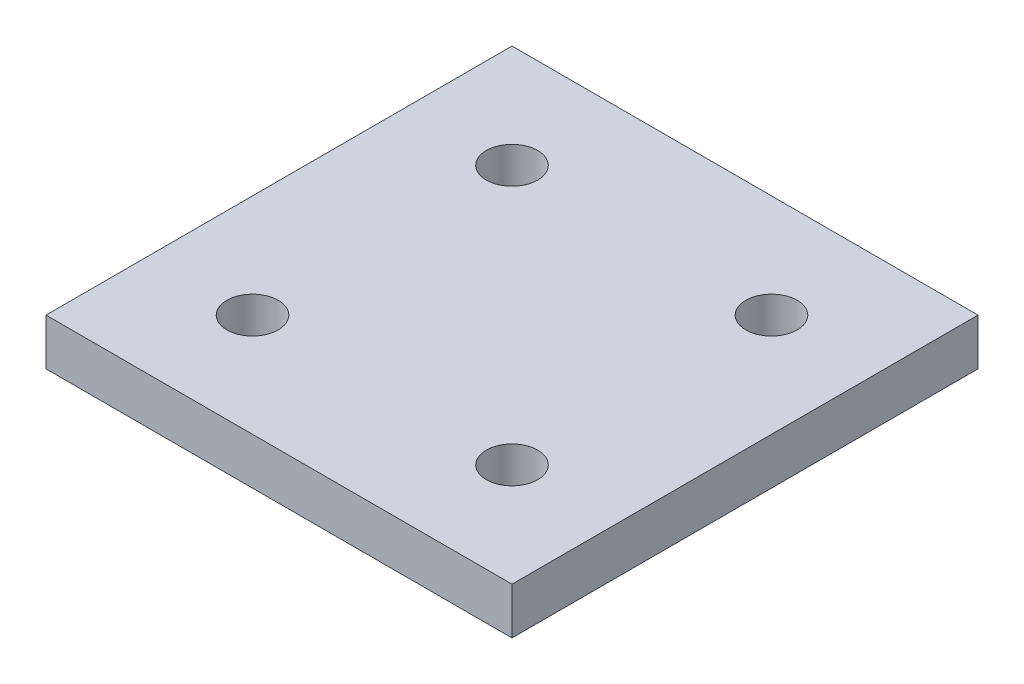
ISO-10303-21;
HEADER;
FILE_DESCRIPTION(('STEP AP214'),'2;1');
FILE_NAME('part.step','',(''),(''),'','','');
FILE_SCHEMA(('AUTOMOTIVE_DESIGN { 1 0 10303 214 1 1 1 1 }'));
ENDSEC;
DATA;
#1=APPLICATION_CONTEXT('core data for automotive mechanical design processes');
#2=APPLICATION_PROTOCOL_DEFINITION('international standard','automotive_design',2000,#1);
#3=PRODUCT_CONTEXT('',#1,'mechanical');
#4=PRODUCT('Part','Part','',(#3));
#5=PRODUCT_RELATED_PRODUCT_CATEGORY('part','',(#4));
#6=PRODUCT_DEFINITION_FORMATION('','',#4);
#7=PRODUCT_DEFINITION_CONTEXT('part definition',#1,'design');
#8=PRODUCT_DEFINITION('design','',#6,#7);
#9=PRODUCT_DEFINITION_SHAPE('','',#8);
#10=(LENGTH_UNIT() NAMED_UNIT(*) SI_UNIT(.MILLI.,.METRE.));
#11=(NAMED_UNIT(*) PLANE_ANGLE_UNIT() SI_UNIT($,.RADIAN.));
#12=(NAMED_UNIT(*) SI_UNIT($,.STERADIAN.) SOLID_ANGLE_UNIT());
#13=UNCERTAINTY_MEASURE_WITH_UNIT(LENGTH_MEASURE(1.E-05),#10,'distance_accuracy_value','');
#14=(GEOMETRIC_REPRESENTATION_CONTEXT(3) GLOBAL_UNCERTAINTY_ASSIGNED_CONTEXT((#13)) GLOBAL_UNIT_ASSIGNED_CONTEXT((#10,
#11,#12)) REPRESENTATION_CONTEXT('',''));
#15=CARTESIAN_POINT('',(0.,0.,0.));
#16=DIRECTION('',(0.,0.,1.));
#17=DIRECTION('',(1.,0.,0.));
#18=AXIS2_PLACEMENT_3D('',#15,#16,#17);
#19=CARTESIAN_POINT('',(31.75,6.35,-31.75));
#20=DIRECTION('',(-1.,0.,0.));
#21=DIRECTION('',(0.,0.,1.));
#22=AXIS2_PLACEMENT_3D('',#19,#20,#21);
#23=PLANE('',#22);
#24=DIRECTION('',(0.,0.,-1.));
#25=VECTOR('',#24,1.);
#26=CARTESIAN_POINT('',(31.75,0.,-31.75));
#27=LINE('',#26,#25);
#28=CARTESIAN_POINT('',(31.75,0.,31.75));
#29=VERTEX_POINT('',#28);
#30=CARTESIAN_POINT('',(31.75,0.,-31.75));
#31=VERTEX_POINT('',#30);
#32=EDGE_CURVE('E96',#29,#31,#27,.T.);
#33=ORIENTED_EDGE('',*,*,#32,.T.);
#34=DIRECTION('',(0.,-1.,0.));
#35=VECTOR('',#34,1.);
#36=CARTESIAN_POINT('',(31.75,6.35,-31.75));
#37=LINE('',#36,#35);
#38=CARTESIAN_POINT('',(31.75,6.35,-31.75));
#39=VERTEX_POINT('',#38);
#40=EDGE_CURVE('E11',#39,#31,#37,.T.);
#41=ORIENTED_EDGE('',*,*,#40,.F.);
#42=DIRECTION('',(0.,0.,-1.));
#43=VECTOR('',#42,1.);
#44=CARTESIAN_POINT('',(31.75,6.35,-31.75));
#45=LINE('',#44,#43);
#46=CARTESIAN_POINT('',(31.75,6.35,31.75));
#47=VERTEX_POINT('',#46);
#48=EDGE_CURVE('E84',#47,#39,#45,.T.);
#49=ORIENTED_EDGE('',*,*,#48,.F.);
#50=DIRECTION('',(0.,-1.,0.));
#51=VECTOR('',#50,1.);
#52=CARTESIAN_POINT('',(31.75,6.35,31.75));
#53=LINE('',#52,#51);
#54=EDGE_CURVE('E92',#47,#29,#53,.T.);
#55=ORIENTED_EDGE('',*,*,#54,.T.);
#56=EDGE_LOOP('',(#33,#41,#49,#55));
#57=FACE_BOUND('',#56,.T.);
#58=ADVANCED_FACE('F33',(#57),#23,.F.);
#59=CARTESIAN_POINT('',(-31.75,6.35,-31.75));
#60=DIRECTION('',(0.,0.,1.));
#61=DIRECTION('',(1.,0.,0.));
#62=AXIS2_PLACEMENT_3D('',#59,#60,#61);
#63=PLANE('',#62);
#64=DIRECTION('',(-1.,0.,0.));
#65=VECTOR('',#64,1.);
#66=CARTESIAN_POINT('',(-31.75,0.,-31.75));
#67=LINE('',#66,#65);
#68=CARTESIAN_POINT('',(-31.75,0.,-31.75));
#69=VERTEX_POINT('',#68);
#70=EDGE_CURVE('E88',#31,#69,#67,.T.);
#71=ORIENTED_EDGE('',*,*,#70,.T.);
#72=DIRECTION('',(0.,-1.,0.));
#73=VECTOR('',#72,1.);
#74=CARTESIAN_POINT('',(-31.75,6.35,-31.75));
#75=LINE('',#74,#73);
#76=CARTESIAN_POINT('',(-31.75,6.35,-31.75));
#77=VERTEX_POINT('',#76);
#78=EDGE_CURVE('E41',#77,#69,#75,.T.);
#79=ORIENTED_EDGE('',*,*,#78,.F.);
#80=DIRECTION('',(-1.,0.,0.));
#81=VECTOR('',#80,1.);
#82=CARTESIAN_POINT('',(-31.75,6.35,-31.75));
#83=LINE('',#82,#81);
#84=EDGE_CURVE('E79',#39,#77,#83,.T.);
#85=ORIENTED_EDGE('',*,*,#84,.F.);
#86=ORIENTED_EDGE('',*,*,#40,.T.);
#87=EDGE_LOOP('',(#71,#79,#85,#86));
#88=FACE_BOUND('',#87,.T.);
#89=ADVANCED_FACE('F87',(#88),#63,.F.);
#90=CARTESIAN_POINT('',(-31.75,6.35,-31.75));
#91=DIRECTION('',(1.,0.,0.));
#92=DIRECTION('',(0.,0.,-1.));
#93=AXIS2_PLACEMENT_3D('',#90,#91,#92);
#94=PLANE('',#93);
#95=DIRECTION('',(0.,0.,1.));
#96=VECTOR('',#95,1.);
#97=CARTESIAN_POINT('',(-31.75,0.,-31.75));
#98=LINE('',#97,#96);
#99=CARTESIAN_POINT('',(-31.75,0.,31.75));
#100=VERTEX_POINT('',#99);
#101=EDGE_CURVE('E66',#69,#100,#98,.T.);
#102=ORIENTED_EDGE('',*,*,#101,.T.);
#103=DIRECTION('',(0.,-1.,0.));
#104=VECTOR('',#103,1.);
#105=CARTESIAN_POINT('',(-31.75,6.35,31.75));
#106=LINE('',#105,#104);
#107=CARTESIAN_POINT('',(-31.75,6.35,31.75));
#108=VERTEX_POINT('',#107);
#109=EDGE_CURVE('E89',#108,#100,#106,.T.);
#110=ORIENTED_EDGE('',*,*,#109,.F.);
#111=DIRECTION('',(0.,0.,1.));
#112=VECTOR('',#111,1.);
#113=CARTESIAN_POINT('',(-31.75,6.35,-31.75));
#114=LINE('',#113,#112);
#115=EDGE_CURVE('E82',#77,#108,#114,.T.);
#116=ORIENTED_EDGE('',*,*,#115,.F.);
#117=ORIENTED_EDGE('',*,*,#78,.T.);
#118=EDGE_LOOP('',(#102,#110,#116,#117));
#119=FACE_BOUND('',#118,.T.);
#120=ADVANCED_FACE('F90',(#119),#94,.F.);
#121=CARTESIAN_POINT('',(-31.75,6.35,31.75));
#122=DIRECTION('',(0.,0.,-1.));
#123=DIRECTION('',(-1.,0.,0.));
#124=AXIS2_PLACEMENT_3D('',#121,#122,#123);
#125=PLANE('',#124);
#126=DIRECTION('',(1.,0.,0.));
#127=VECTOR('',#126,1.);
#128=CARTESIAN_POINT('',(-31.75,0.,31.75));
#129=LINE('',#128,#127);
#130=EDGE_CURVE('E72',#100,#29,#129,.T.);
#131=ORIENTED_EDGE('',*,*,#130,.T.);
#132=ORIENTED_EDGE('',*,*,#54,.F.);
#133=DIRECTION('',(1.,0.,0.));
#134=VECTOR('',#133,1.);
#135=CARTESIAN_POINT('',(-31.75,6.35,31.75));
#136=LINE('',#135,#134);
#137=EDGE_CURVE('E49',#108,#47,#136,.T.);
#138=ORIENTED_EDGE('',*,*,#137,.F.);
#139=ORIENTED_EDGE('',*,*,#109,.T.);
#140=EDGE_LOOP('',(#131,#132,#138,#139));
#141=FACE_BOUND('',#140,.T.);
#142=ADVANCED_FACE('F104',(#141),#125,.F.);
#143=CARTESIAN_POINT('',(0.,6.35,0.));
#144=DIRECTION('',(0.,1.,0.));
#145=DIRECTION('',(0.,0.,1.));
#146=AXIS2_PLACEMENT_3D('',#143,#144,#145);
#147=PLANE('',#146);
#148=CARTESIAN_POINT('',(-17.68,6.35,17.68));
#149=DIRECTION('',(0.,1.,0.));
#150=DIRECTION('',(0.,0.,1.));
#151=AXIS2_PLACEMENT_3D('',#148,#149,#150);
#152=CIRCLE('',#151,3.5);
#153=CARTESIAN_POINT('',(-17.68,6.35,21.18));
#154=VERTEX_POINT('',#153);
#155=EDGE_CURVE('E120',#154,#154,#152,.T.);
#156=ORIENTED_EDGE('',*,*,#155,.F.);
#157=EDGE_LOOP('',(#156));
#158=FACE_BOUND('',#157,.T.);
#159=CARTESIAN_POINT('',(17.68,6.35,17.68));
#160=DIRECTION('',(0.,1.,0.));
#161=DIRECTION('',(0.,0.,1.));
#162=AXIS2_PLACEMENT_3D('',#159,#160,#161);
#163=CIRCLE('',#162,3.5);
#164=CARTESIAN_POINT('',(17.68,6.35,21.18));
#165=VERTEX_POINT('',#164);
#166=EDGE_CURVE('E119',#165,#165,#163,.T.);
#167=ORIENTED_EDGE('',*,*,#166,.F.);
#168=EDGE_LOOP('',(#167));
#169=FACE_BOUND('',#168,.T.);
#170=CARTESIAN_POINT('',(17.68,6.35,-17.68));
#171=DIRECTION('',(0.,1.,0.));
#172=DIRECTION('',(0.,0.,1.));
#173=AXIS2_PLACEMENT_3D('',#170,#171,#172);
#174=CIRCLE('',#173,3.5);
#175=CARTESIAN_POINT('',(17.68,6.35,-14.18));
#176=VERTEX_POINT('',#175);
#177=EDGE_CURVE('E126',#176,#176,#174,.T.);
#178=ORIENTED_EDGE('',*,*,#177,.F.);
#179=EDGE_LOOP('',(#178));
#180=FACE_BOUND('',#179,.T.);
#181=CARTESIAN_POINT('',(-17.68,6.35,-17.68));
#182=DIRECTION('',(0.,1.,0.));
#183=DIRECTION('',(0.,0.,1.));
#184=AXIS2_PLACEMENT_3D('',#181,#182,#183);
#185=CIRCLE('',#184,3.5);
#186=CARTESIAN_POINT('',(-17.68,6.35,-14.18));
#187=VERTEX_POINT('',#186);
#188=EDGE_CURVE('E112',#187,#187,#185,.T.);
#189=ORIENTED_EDGE('',*,*,#188,.F.);
#190=EDGE_LOOP('',(#189));
#191=FACE_BOUND('',#190,.T.);
#192=ORIENTED_EDGE('',*,*,#48,.T.);
#193=ORIENTED_EDGE('',*,*,#84,.T.);
#194=ORIENTED_EDGE('',*,*,#115,.T.);
#195=ORIENTED_EDGE('',*,*,#137,.T.);
#196=EDGE_LOOP('',(#192,#193,#194,#195));
#197=FACE_BOUND('',#196,.T.);
#198=ADVANCED_FACE('F80',(#158,#169,#180,#191,#197),#147,.T.);
#199=CARTESIAN_POINT('',(0.,0.,0.));
#200=DIRECTION('',(0.,1.,0.));
#201=DIRECTION('',(0.,0.,1.));
#202=AXIS2_PLACEMENT_3D('',#199,#200,#201);
#203=PLANE('',#202);
#204=CARTESIAN_POINT('',(-17.68,0.,17.68));
#205=DIRECTION('',(0.,1.,0.));
#206=DIRECTION('',(0.,0.,1.));
#207=AXIS2_PLACEMENT_3D('',#204,#205,#206);
#208=CIRCLE('',#207,3.5);
#209=CARTESIAN_POINT('',(-17.68,0.,21.18));
#210=VERTEX_POINT('',#209);
#211=EDGE_CURVE('E116',#210,#210,#208,.F.);
#212=ORIENTED_EDGE('',*,*,#211,.F.);
#213=EDGE_LOOP('',(#212));
#214=FACE_BOUND('',#213,.T.);
#215=CARTESIAN_POINT('',(17.68,0.,17.68));
#216=DIRECTION('',(0.,1.,0.));
#217=DIRECTION('',(0.,0.,1.));
#218=AXIS2_PLACEMENT_3D('',#215,#216,#217);
#219=CIRCLE('',#218,3.5);
#220=CARTESIAN_POINT('',(17.68,0.,21.18));
#221=VERTEX_POINT('',#220);
#222=EDGE_CURVE('E123',#221,#221,#219,.F.);
#223=ORIENTED_EDGE('',*,*,#222,.F.);
#224=EDGE_LOOP('',(#223));
#225=FACE_BOUND('',#224,.T.);
#226=CARTESIAN_POINT('',(17.68,0.,-17.68));
#227=DIRECTION('',(0.,1.,0.));
#228=DIRECTION('',(0.,0.,1.));
#229=AXIS2_PLACEMENT_3D('',#226,#227,#228);
#230=CIRCLE('',#229,3.5);
#231=CARTESIAN_POINT('',(17.68,0.,-14.18));
#232=VERTEX_POINT('',#231);
#233=EDGE_CURVE('E115',#232,#232,#230,.F.);
#234=ORIENTED_EDGE('',*,*,#233,.F.);
#235=EDGE_LOOP('',(#234));
#236=FACE_BOUND('',#235,.T.);
#237=CARTESIAN_POINT('',(-17.68,0.,-17.68));
#238=DIRECTION('',(0.,1.,0.));
#239=DIRECTION('',(0.,0.,1.));
#240=AXIS2_PLACEMENT_3D('',#237,#238,#239);
#241=CIRCLE('',#240,3.5);
#242=CARTESIAN_POINT('',(-17.68,0.,-14.18));
#243=VERTEX_POINT('',#242);
#244=EDGE_CURVE('E99',#243,#243,#241,.F.);
#245=ORIENTED_EDGE('',*,*,#244,.F.);
#246=EDGE_LOOP('',(#245));
#247=FACE_BOUND('',#246,.T.);
#248=ORIENTED_EDGE('',*,*,#32,.F.);
#249=ORIENTED_EDGE('',*,*,#130,.F.);
#250=ORIENTED_EDGE('',*,*,#101,.F.);
#251=ORIENTED_EDGE('',*,*,#70,.F.);
#252=EDGE_LOOP('',(#248,#249,#250,#251));
#253=FACE_BOUND('',#252,.T.);
#254=ADVANCED_FACE('F107',(#214,#225,#236,#247,#253),#203,.F.);
#255=CARTESIAN_POINT('',(-17.68,-9.89949493661167,-17.68));
#256=DIRECTION('',(0.,1.,0.));
#257=DIRECTION('',(0.,0.,1.));
#258=AXIS2_PLACEMENT_3D('',#255,#256,#257);
#259=CYLINDRICAL_SURFACE('',#258,3.5);
#260=ORIENTED_EDGE('',*,*,#244,.T.);
#261=EDGE_LOOP('',(#260));
#262=FACE_BOUND('',#261,.T.);
#263=ORIENTED_EDGE('',*,*,#188,.T.);
#264=EDGE_LOOP('',(#263));
#265=FACE_BOUND('',#264,.T.);
#266=ADVANCED_FACE('F142',(#262,#265),#259,.F.);
#267=CARTESIAN_POINT('',(17.68,-9.89949493661167,-17.68));
#268=DIRECTION('',(0.,1.,0.));
#269=DIRECTION('',(0.,0.,1.));
#270=AXIS2_PLACEMENT_3D('',#267,#268,#269);
#271=CYLINDRICAL_SURFACE('',#270,3.5);
#272=ORIENTED_EDGE('',*,*,#233,.T.);
#273=EDGE_LOOP('',(#272));
#274=FACE_BOUND('',#273,.T.);
#275=ORIENTED_EDGE('',*,*,#177,.T.);
#276=EDGE_LOOP('',(#275));
#277=FACE_BOUND('',#276,.T.);
#278=ADVANCED_FACE('F134',(#274,#277),#271,.F.);
#279=CARTESIAN_POINT('',(17.68,-9.89949493661167,17.68));
#280=DIRECTION('',(0.,1.,0.));
#281=DIRECTION('',(0.,0.,1.));
#282=AXIS2_PLACEMENT_3D('',#279,#280,#281);
#283=CYLINDRICAL_SURFACE('',#282,3.5);
#284=ORIENTED_EDGE('',*,*,#222,.T.);
#285=EDGE_LOOP('',(#284));
#286=FACE_BOUND('',#285,.T.);
#287=ORIENTED_EDGE('',*,*,#166,.T.);
#288=EDGE_LOOP('',(#287));
#289=FACE_BOUND('',#288,.T.);
#290=ADVANCED_FACE('F150',(#286,#289),#283,.F.);
#291=CARTESIAN_POINT('',(-17.68,-9.89949493661167,17.68));
#292=DIRECTION('',(0.,1.,0.));
#293=DIRECTION('',(0.,0.,1.));
#294=AXIS2_PLACEMENT_3D('',#291,#292,#293);
#295=CYLINDRICAL_SURFACE('',#294,3.5);
#296=ORIENTED_EDGE('',*,*,#211,.T.);
#297=EDGE_LOOP('',(#296));
#298=FACE_BOUND('',#297,.T.);
#299=ORIENTED_EDGE('',*,*,#155,.T.);
#300=EDGE_LOOP('',(#299));
#301=FACE_BOUND('',#300,.T.);
#302=ADVANCED_FACE('F199',(#298,#301),#295,.F.);
#303=CLOSED_SHELL('',(#58,#89,#120,#142,#198,#254,#266,#278,#290,#302));
#304=MANIFOLD_SOLID_BREP('B2',#303);
#305=ADVANCED_BREP_SHAPE_REPRESENTATION('',(#18,#304),#14);
#306=SHAPE_DEFINITION_REPRESENTATION(#9,#305);
ENDSEC;
END-ISO-10303-21;
